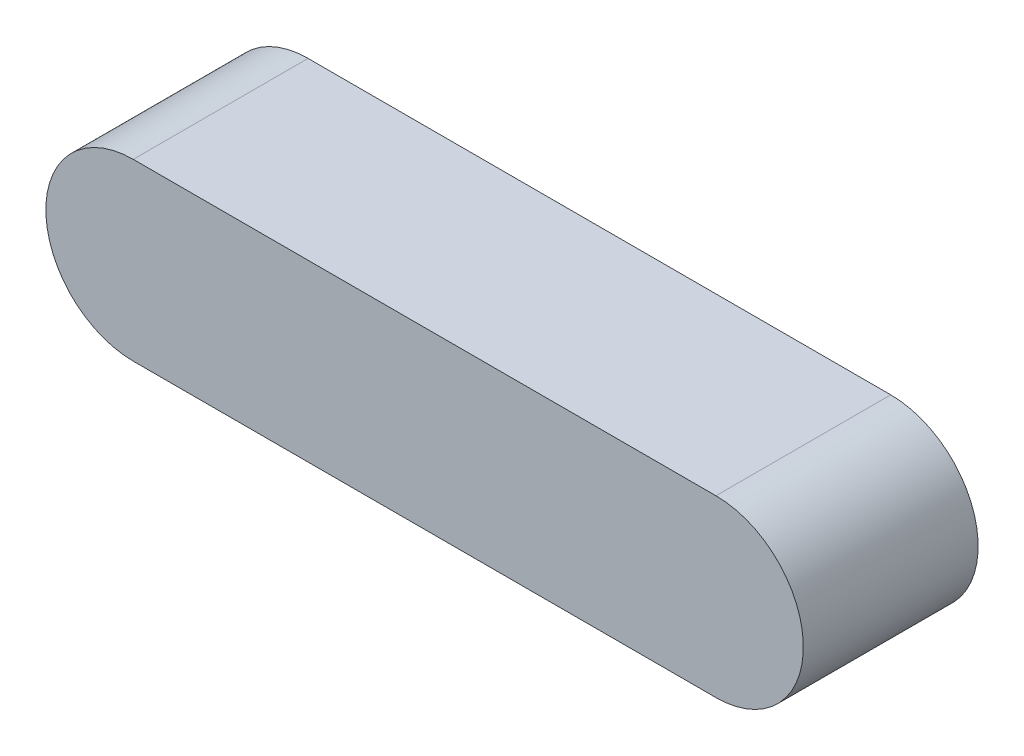
ISO-10303-21;
HEADER;
FILE_DESCRIPTION(('STEP AP214'),'2;1');
FILE_NAME('part.step','',(''),(''),'','','');
FILE_SCHEMA(('AUTOMOTIVE_DESIGN { 1 0 10303 214 1 1 1 1 }'));
ENDSEC;
DATA;
#1=APPLICATION_CONTEXT('core data for automotive mechanical design processes');
#2=APPLICATION_PROTOCOL_DEFINITION('international standard','automotive_design',2000,#1);
#3=PRODUCT_CONTEXT('',#1,'mechanical');
#4=PRODUCT('Part','Part','',(#3));
#5=PRODUCT_RELATED_PRODUCT_CATEGORY('part','',(#4));
#6=PRODUCT_DEFINITION_FORMATION('','',#4);
#7=PRODUCT_DEFINITION_CONTEXT('part definition',#1,'design');
#8=PRODUCT_DEFINITION('design','',#6,#7);
#9=PRODUCT_DEFINITION_SHAPE('','',#8);
#10=(LENGTH_UNIT() NAMED_UNIT(*) SI_UNIT(.MILLI.,.METRE.));
#11=(NAMED_UNIT(*) PLANE_ANGLE_UNIT() SI_UNIT($,.RADIAN.));
#12=(NAMED_UNIT(*) SI_UNIT($,.STERADIAN.) SOLID_ANGLE_UNIT());
#13=UNCERTAINTY_MEASURE_WITH_UNIT(LENGTH_MEASURE(1.E-05),#10,'distance_accuracy_value','');
#14=(GEOMETRIC_REPRESENTATION_CONTEXT(3) GLOBAL_UNCERTAINTY_ASSIGNED_CONTEXT((#13)) GLOBAL_UNIT_ASSIGNED_CONTEXT((#10,
#11,#12)) REPRESENTATION_CONTEXT('',''));
#15=CARTESIAN_POINT('',(0.,0.,0.));
#16=DIRECTION('',(0.,0.,1.));
#17=DIRECTION('',(1.,0.,0.));
#18=AXIS2_PLACEMENT_3D('',#15,#16,#17);
#19=CARTESIAN_POINT('',(48.,0.,3.));
#20=DIRECTION('',(0.,0.,-1.));
#21=DIRECTION('',(-1.,0.,0.));
#22=AXIS2_PLACEMENT_3D('',#19,#20,#21);
#23=CYLINDRICAL_SURFACE('',#22,1.5);
#24=CARTESIAN_POINT('',(48.,0.,0.));
#25=DIRECTION('',(0.,0.,1.));
#26=DIRECTION('',(1.,0.,0.));
#27=AXIS2_PLACEMENT_3D('',#24,#25,#26);
#28=CIRCLE('',#27,1.5);
#29=CARTESIAN_POINT('',(48.,1.5,0.));
#30=VERTEX_POINT('',#29);
#31=CARTESIAN_POINT('',(48.,-1.5,0.));
#32=VERTEX_POINT('',#31);
#33=EDGE_CURVE('E394',#30,#32,#28,.T.);
#34=ORIENTED_EDGE('',*,*,#33,.T.);
#35=DIRECTION('',(0.,0.,-1.));
#36=VECTOR('',#35,1.);
#37=CARTESIAN_POINT('',(48.,-1.5,3.));
#38=LINE('',#37,#36);
#39=CARTESIAN_POINT('',(48.,-1.5,3.));
#40=VERTEX_POINT('',#39);
#41=EDGE_CURVE('E11',#40,#32,#38,.T.);
#42=ORIENTED_EDGE('',*,*,#41,.F.);
#43=CARTESIAN_POINT('',(48.,0.,3.));
#44=DIRECTION('',(0.,0.,1.));
#45=DIRECTION('',(1.,0.,0.));
#46=AXIS2_PLACEMENT_3D('',#43,#44,#45);
#47=CIRCLE('',#46,1.5);
#48=CARTESIAN_POINT('',(48.,1.5,3.));
#49=VERTEX_POINT('',#48);
#50=EDGE_CURVE('E412',#49,#40,#47,.T.);
#51=ORIENTED_EDGE('',*,*,#50,.F.);
#52=DIRECTION('',(0.,0.,-1.));
#53=VECTOR('',#52,1.);
#54=CARTESIAN_POINT('',(48.,1.5,3.));
#55=LINE('',#54,#53);
#56=EDGE_CURVE('E406',#49,#30,#55,.T.);
#57=ORIENTED_EDGE('',*,*,#56,.T.);
#58=EDGE_LOOP('',(#34,#42,#51,#57));
#59=FACE_BOUND('',#58,.T.);
#60=ADVANCED_FACE('F350',(#59),#23,.T.);
#61=CARTESIAN_POINT('',(48.,-1.5,3.));
#62=DIRECTION('',(0.,1.,0.));
#63=DIRECTION('',(0.,0.,1.));
#64=AXIS2_PLACEMENT_3D('',#61,#62,#63);
#65=PLANE('',#64);
#66=DIRECTION('',(1.,0.,0.));
#67=VECTOR('',#66,1.);
#68=CARTESIAN_POINT('',(48.,-1.5,0.));
#69=LINE('',#68,#67);
#70=CARTESIAN_POINT('',(58.,-1.5,0.));
#71=VERTEX_POINT('',#70);
#72=EDGE_CURVE('E390',#32,#71,#69,.T.);
#73=ORIENTED_EDGE('',*,*,#72,.T.);
#74=DIRECTION('',(0.,0.,-1.));
#75=VECTOR('',#74,1.);
#76=CARTESIAN_POINT('',(58.,-1.5,3.));
#77=LINE('',#76,#75);
#78=CARTESIAN_POINT('',(58.,-1.5,3.));
#79=VERTEX_POINT('',#78);
#80=EDGE_CURVE('E357',#79,#71,#77,.T.);
#81=ORIENTED_EDGE('',*,*,#80,.F.);
#82=DIRECTION('',(1.,0.,0.));
#83=VECTOR('',#82,1.);
#84=CARTESIAN_POINT('',(48.,-1.5,3.));
#85=LINE('',#84,#83);
#86=EDGE_CURVE('E402',#40,#79,#85,.T.);
#87=ORIENTED_EDGE('',*,*,#86,.F.);
#88=ORIENTED_EDGE('',*,*,#41,.T.);
#89=EDGE_LOOP('',(#73,#81,#87,#88));
#90=FACE_BOUND('',#89,.T.);
#91=ADVANCED_FACE('F401',(#90),#65,.F.);
#92=CARTESIAN_POINT('',(58.,0.,3.));
#93=DIRECTION('',(0.,0.,-1.));
#94=DIRECTION('',(-1.,0.,0.));
#95=AXIS2_PLACEMENT_3D('',#92,#93,#94);
#96=CYLINDRICAL_SURFACE('',#95,1.5);
#97=CARTESIAN_POINT('',(58.,0.,0.));
#98=DIRECTION('',(0.,0.,1.));
#99=DIRECTION('',(1.,0.,0.));
#100=AXIS2_PLACEMENT_3D('',#97,#98,#99);
#101=CIRCLE('',#100,1.5);
#102=CARTESIAN_POINT('',(58.,1.5,0.));
#103=VERTEX_POINT('',#102);
#104=EDGE_CURVE('E395',#71,#103,#101,.T.);
#105=ORIENTED_EDGE('',*,*,#104,.T.);
#106=DIRECTION('',(0.,0.,-1.));
#107=VECTOR('',#106,1.);
#108=CARTESIAN_POINT('',(58.,1.5,3.));
#109=LINE('',#108,#107);
#110=CARTESIAN_POINT('',(58.,1.5,3.));
#111=VERTEX_POINT('',#110);
#112=EDGE_CURVE('E418',#111,#103,#109,.T.);
#113=ORIENTED_EDGE('',*,*,#112,.F.);
#114=CARTESIAN_POINT('',(58.,0.,3.));
#115=DIRECTION('',(0.,0.,1.));
#116=DIRECTION('',(1.,0.,0.));
#117=AXIS2_PLACEMENT_3D('',#114,#115,#116);
#118=CIRCLE('',#117,1.5);
#119=EDGE_CURVE('E369',#79,#111,#118,.T.);
#120=ORIENTED_EDGE('',*,*,#119,.F.);
#121=ORIENTED_EDGE('',*,*,#80,.T.);
#122=EDGE_LOOP('',(#105,#113,#120,#121));
#123=FACE_BOUND('',#122,.T.);
#124=ADVANCED_FACE('F421',(#123),#96,.T.);
#125=CARTESIAN_POINT('',(48.,1.5,3.));
#126=DIRECTION('',(0.,-1.,0.));
#127=DIRECTION('',(0.,0.,-1.));
#128=AXIS2_PLACEMENT_3D('',#125,#126,#127);
#129=PLANE('',#128);
#130=DIRECTION('',(-1.,0.,0.));
#131=VECTOR('',#130,1.);
#132=CARTESIAN_POINT('',(48.,1.5,0.));
#133=LINE('',#132,#131);
#134=EDGE_CURVE('E410',#103,#30,#133,.T.);
#135=ORIENTED_EDGE('',*,*,#134,.T.);
#136=ORIENTED_EDGE('',*,*,#56,.F.);
#137=DIRECTION('',(-1.,0.,0.));
#138=VECTOR('',#137,1.);
#139=CARTESIAN_POINT('',(48.,1.5,3.));
#140=LINE('',#139,#138);
#141=EDGE_CURVE('E364',#111,#49,#140,.T.);
#142=ORIENTED_EDGE('',*,*,#141,.F.);
#143=ORIENTED_EDGE('',*,*,#112,.T.);
#144=EDGE_LOOP('',(#135,#136,#142,#143));
#145=FACE_BOUND('',#144,.T.);
#146=ADVANCED_FACE('F423',(#145),#129,.F.);
#147=CARTESIAN_POINT('',(48.,0.,3.));
#148=DIRECTION('',(0.,0.,1.));
#149=DIRECTION('',(1.,0.,0.));
#150=AXIS2_PLACEMENT_3D('',#147,#148,#149);
#151=PLANE('',#150);
#152=ORIENTED_EDGE('',*,*,#50,.T.);
#153=ORIENTED_EDGE('',*,*,#86,.T.);
#154=ORIENTED_EDGE('',*,*,#119,.T.);
#155=ORIENTED_EDGE('',*,*,#141,.T.);
#156=EDGE_LOOP('',(#152,#153,#154,#155));
#157=FACE_BOUND('',#156,.T.);
#158=ADVANCED_FACE('F424',(#157),#151,.T.);
#159=CARTESIAN_POINT('',(48.,0.,0.));
#160=DIRECTION('',(0.,0.,1.));
#161=DIRECTION('',(1.,0.,0.));
#162=AXIS2_PLACEMENT_3D('',#159,#160,#161);
#163=PLANE('',#162);
#164=ORIENTED_EDGE('',*,*,#33,.F.);
#165=ORIENTED_EDGE('',*,*,#134,.F.);
#166=ORIENTED_EDGE('',*,*,#104,.F.);
#167=ORIENTED_EDGE('',*,*,#72,.F.);
#168=EDGE_LOOP('',(#164,#165,#166,#167));
#169=FACE_BOUND('',#168,.T.);
#170=ADVANCED_FACE('F391',(#169),#163,.F.);
#171=CLOSED_SHELL('',(#60,#91,#124,#146,#158,#170));
#172=MANIFOLD_SOLID_BREP('B2',#171);
#173=ADVANCED_BREP_SHAPE_REPRESENTATION('',(#18,#172),#14);
#174=SHAPE_DEFINITION_REPRESENTATION(#9,#173);
ENDSEC;
END-ISO-10303-21;
